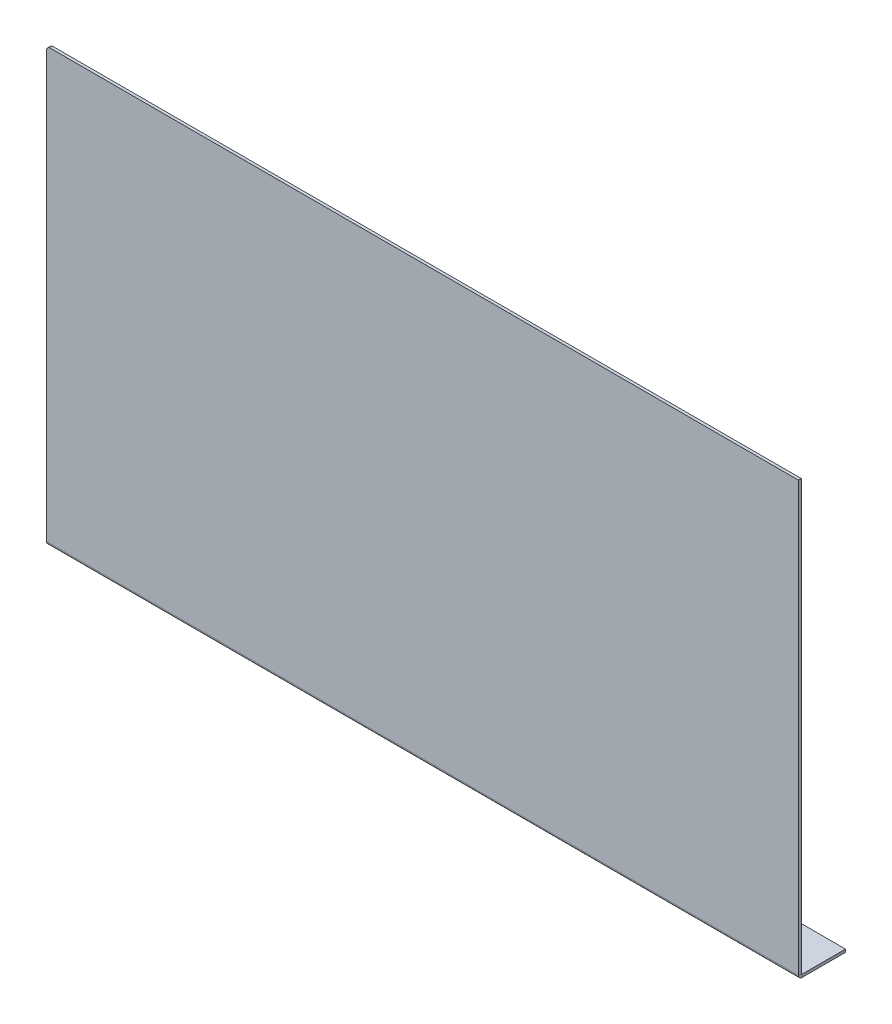
ISO-10303-21;
HEADER;
FILE_DESCRIPTION(('STEP AP214'),'2;1');
FILE_NAME('part.step','',(''),(''),'','','');
FILE_SCHEMA(('AUTOMOTIVE_DESIGN { 1 0 10303 214 1 1 1 1 }'));
ENDSEC;
DATA;
#1=APPLICATION_CONTEXT('core data for automotive mechanical design processes');
#2=APPLICATION_PROTOCOL_DEFINITION('international standard','automotive_design',2000,#1);
#3=PRODUCT_CONTEXT('',#1,'mechanical');
#4=PRODUCT('Part','Part','',(#3));
#5=PRODUCT_RELATED_PRODUCT_CATEGORY('part','',(#4));
#6=PRODUCT_DEFINITION_FORMATION('','',#4);
#7=PRODUCT_DEFINITION_CONTEXT('part definition',#1,'design');
#8=PRODUCT_DEFINITION('design','',#6,#7);
#9=PRODUCT_DEFINITION_SHAPE('','',#8);
#10=(LENGTH_UNIT() NAMED_UNIT(*) SI_UNIT(.MILLI.,.METRE.));
#11=(NAMED_UNIT(*) PLANE_ANGLE_UNIT() SI_UNIT($,.RADIAN.));
#12=(NAMED_UNIT(*) SI_UNIT($,.STERADIAN.) SOLID_ANGLE_UNIT());
#13=UNCERTAINTY_MEASURE_WITH_UNIT(LENGTH_MEASURE(1.E-05),#10,'distance_accuracy_value','');
#14=(GEOMETRIC_REPRESENTATION_CONTEXT(3) GLOBAL_UNCERTAINTY_ASSIGNED_CONTEXT((#13)) GLOBAL_UNIT_ASSIGNED_CONTEXT((#10,
#11,#12)) REPRESENTATION_CONTEXT('',''));
#15=CARTESIAN_POINT('',(0.,0.,0.));
#16=DIRECTION('',(0.,0.,1.));
#17=DIRECTION('',(1.,0.,0.));
#18=AXIS2_PLACEMENT_3D('',#15,#16,#17);
#19=CARTESIAN_POINT('',(176.5,-124.5,-25.));
#20=DIRECTION('',(-1.,0.,0.));
#21=DIRECTION('',(0.,-1.,0.));
#22=AXIS2_PLACEMENT_3D('',#19,#20,#21);
#23=PLANE('',#22);
#24=DIRECTION('',(0.,0.,-1.));
#25=VECTOR('',#24,1.);
#26=CARTESIAN_POINT('',(176.5,-122.171572875254,-23.5));
#27=LINE('',#26,#25);
#28=CARTESIAN_POINT('',(176.5,-122.171572875254,-23.5));
#29=VERTEX_POINT('',#28);
#30=CARTESIAN_POINT('',(176.5,-122.171572875254,-25.));
#31=VERTEX_POINT('',#30);
#32=EDGE_CURVE('E315',#29,#31,#27,.T.);
#33=ORIENTED_EDGE('',*,*,#32,.T.);
#34=DIRECTION('',(0.,-1.,0.));
#35=VECTOR('',#34,1.);
#36=CARTESIAN_POINT('',(176.5,5.20906600551264E-13,-25.));
#37=LINE('',#36,#35);
#38=CARTESIAN_POINT('',(176.5,-115.5,-25.));
#39=VERTEX_POINT('',#38);
#40=EDGE_CURVE('E334',#39,#31,#37,.T.);
#41=ORIENTED_EDGE('',*,*,#40,.F.);
#42=DIRECTION('',(0.,0.,1.));
#43=VECTOR('',#42,1.);
#44=CARTESIAN_POINT('',(176.5,-115.5,-23.5));
#45=LINE('',#44,#43);
#46=CARTESIAN_POINT('',(176.5,-115.5,-23.5));
#47=VERTEX_POINT('',#46);
#48=EDGE_CURVE('E343',#47,#39,#45,.F.);
#49=ORIENTED_EDGE('',*,*,#48,.F.);
#50=DIRECTION('',(0.,1.,0.));
#51=VECTOR('',#50,1.);
#52=CARTESIAN_POINT('',(176.5,-124.5,-23.5));
#53=LINE('',#52,#51);
#54=EDGE_CURVE('E338',#47,#29,#53,.F.);
#55=ORIENTED_EDGE('',*,*,#54,.T.);
#56=EDGE_LOOP('',(#33,#41,#49,#55));
#57=FACE_BOUND('',#56,.T.);
#58=ADVANCED_FACE('F99',(#57),#23,.F.);
#59=CARTESIAN_POINT('',(-176.5,-115.,-25.));
#60=DIRECTION('',(1.,0.,0.));
#61=DIRECTION('',(0.,0.,-1.));
#62=AXIS2_PLACEMENT_3D('',#59,#60,#61);
#63=PLANE('',#62);
#64=DIRECTION('',(0.,0.,-1.));
#65=VECTOR('',#64,1.);
#66=CARTESIAN_POINT('',(-176.5,-122.171572875254,-23.5));
#67=LINE('',#66,#65);
#68=CARTESIAN_POINT('',(-176.5,-122.171572875254,-23.5));
#69=VERTEX_POINT('',#68);
#70=CARTESIAN_POINT('',(-176.5,-122.171572875254,-25.));
#71=VERTEX_POINT('',#70);
#72=EDGE_CURVE('E325',#69,#71,#67,.T.);
#73=ORIENTED_EDGE('',*,*,#72,.F.);
#74=DIRECTION('',(0.,-1.,0.));
#75=VECTOR('',#74,1.);
#76=CARTESIAN_POINT('',(-176.5,-115.,-23.5));
#77=LINE('',#76,#75);
#78=CARTESIAN_POINT('',(-176.5,-115.5,-23.5));
#79=VERTEX_POINT('',#78);
#80=EDGE_CURVE('E336',#69,#79,#77,.F.);
#81=ORIENTED_EDGE('',*,*,#80,.T.);
#82=DIRECTION('',(0.,0.,1.));
#83=VECTOR('',#82,1.);
#84=CARTESIAN_POINT('',(-176.5,-115.5,-25.));
#85=LINE('',#84,#83);
#86=CARTESIAN_POINT('',(-176.5,-115.5,-25.));
#87=VERTEX_POINT('',#86);
#88=EDGE_CURVE('E328',#79,#87,#85,.F.);
#89=ORIENTED_EDGE('',*,*,#88,.T.);
#90=DIRECTION('',(0.,1.,0.));
#91=VECTOR('',#90,1.);
#92=CARTESIAN_POINT('',(-176.5,0.,-25.));
#93=LINE('',#92,#91);
#94=EDGE_CURVE('E331',#71,#87,#93,.T.);
#95=ORIENTED_EDGE('',*,*,#94,.F.);
#96=EDGE_LOOP('',(#73,#81,#89,#95));
#97=FACE_BOUND('',#96,.T.);
#98=ADVANCED_FACE('F560',(#97),#63,.F.);
#99=CARTESIAN_POINT('',(0.,0.,-25.));
#100=DIRECTION('',(0.,0.,1.));
#101=DIRECTION('',(1.,0.,0.));
#102=AXIS2_PLACEMENT_3D('',#99,#100,#101);
#103=PLANE('',#102);
#104=DIRECTION('',(1.,0.,0.));
#105=VECTOR('',#104,1.);
#106=CARTESIAN_POINT('',(176.5,-122.171572875254,-25.));
#107=LINE('',#106,#105);
#108=EDGE_CURVE('E309',#31,#71,#107,.F.);
#109=ORIENTED_EDGE('',*,*,#108,.T.);
#110=ORIENTED_EDGE('',*,*,#94,.T.);
#111=DIRECTION('',(1.,0.,0.));
#112=VECTOR('',#111,1.);
#113=CARTESIAN_POINT('',(-176.5,-115.5,-25.));
#114=LINE('',#113,#112);
#115=EDGE_CURVE('E340',#39,#87,#114,.F.);
#116=ORIENTED_EDGE('',*,*,#115,.F.);
#117=ORIENTED_EDGE('',*,*,#40,.T.);
#118=EDGE_LOOP('',(#109,#110,#116,#117));
#119=FACE_BOUND('',#118,.T.);
#120=ADVANCED_FACE('F566',(#119),#103,.F.);
#121=CARTESIAN_POINT('',(0.,0.,-23.5));
#122=DIRECTION('',(0.,0.,1.));
#123=DIRECTION('',(1.,0.,0.));
#124=AXIS2_PLACEMENT_3D('',#121,#122,#123);
#125=PLANE('',#124);
#126=ORIENTED_EDGE('',*,*,#80,.F.);
#127=DIRECTION('',(1.,0.,0.));
#128=VECTOR('',#127,1.);
#129=CARTESIAN_POINT('',(176.5,-122.171572875254,-23.5));
#130=LINE('',#129,#128);
#131=EDGE_CURVE('E114',#29,#69,#130,.F.);
#132=ORIENTED_EDGE('',*,*,#131,.F.);
#133=ORIENTED_EDGE('',*,*,#54,.F.);
#134=DIRECTION('',(1.,0.,0.));
#135=VECTOR('',#134,1.);
#136=CARTESIAN_POINT('',(-176.5,-115.5,-23.5));
#137=LINE('',#136,#135);
#138=EDGE_CURVE('E346',#79,#47,#137,.T.);
#139=ORIENTED_EDGE('',*,*,#138,.F.);
#140=EDGE_LOOP('',(#126,#132,#133,#139));
#141=FACE_BOUND('',#140,.T.);
#142=ADVANCED_FACE('F613',(#141),#125,.T.);
#143=CARTESIAN_POINT('',(0.,-115.,4.12712693812177E-13));
#144=DIRECTION('',(0.,-1.,0.));
#145=DIRECTION('',(0.,0.,-1.));
#146=AXIS2_PLACEMENT_3D('',#143,#144,#145);
#147=PLANE('',#146);
#148=DIRECTION('',(-1.,0.,0.));
#149=VECTOR('',#148,1.);
#150=CARTESIAN_POINT('',(177.25,-115.,-22.25));
#151=LINE('',#150,#149);
#152=CARTESIAN_POINT('',(177.25,-115.,-22.25));
#153=VERTEX_POINT('',#152);
#154=CARTESIAN_POINT('',(176.5,-115.,-22.25));
#155=VERTEX_POINT('',#154);
#156=EDGE_CURVE('E379',#153,#155,#151,.T.);
#157=ORIENTED_EDGE('',*,*,#156,.F.);
#158=DIRECTION('',(0.,0.,1.));
#159=VECTOR('',#158,1.);
#160=CARTESIAN_POINT('',(177.25,-115.,-25.));
#161=LINE('',#160,#159);
#162=CARTESIAN_POINT('',(177.25,-115.,-25.));
#163=VERTEX_POINT('',#162);
#164=EDGE_CURVE('E374',#163,#153,#161,.T.);
#165=ORIENTED_EDGE('',*,*,#164,.F.);
#166=DIRECTION('',(-1.,0.,0.));
#167=VECTOR('',#166,1.);
#168=CARTESIAN_POINT('',(-200.,-115.,-25.));
#169=LINE('',#168,#167);
#170=CARTESIAN_POINT('',(200.,-115.,-25.));
#171=VERTEX_POINT('',#170);
#172=EDGE_CURVE('E421',#171,#163,#169,.T.);
#173=ORIENTED_EDGE('',*,*,#172,.F.);
#174=DIRECTION('',(0.,0.,-1.));
#175=VECTOR('',#174,1.);
#176=CARTESIAN_POINT('',(200.,-115.,-25.));
#177=LINE('',#176,#175);
#178=CARTESIAN_POINT('',(200.,-115.,-1.79999999999994));
#179=VERTEX_POINT('',#178);
#180=EDGE_CURVE('E425',#179,#171,#177,.T.);
#181=ORIENTED_EDGE('',*,*,#180,.F.);
#182=DIRECTION('',(-1.,0.,0.));
#183=VECTOR('',#182,1.);
#184=CARTESIAN_POINT('',(0.,-115.,-1.79999999999994));
#185=LINE('',#184,#183);
#186=CARTESIAN_POINT('',(-200.,-115.,-1.79999999999989));
#187=VERTEX_POINT('',#186);
#188=EDGE_CURVE('E436',#179,#187,#185,.T.);
#189=ORIENTED_EDGE('',*,*,#188,.T.);
#190=DIRECTION('',(0.,0.,1.));
#191=VECTOR('',#190,1.);
#192=CARTESIAN_POINT('',(-200.,-115.,-1.49999999999992));
#193=LINE('',#192,#191);
#194=CARTESIAN_POINT('',(-200.,-115.,-25.));
#195=VERTEX_POINT('',#194);
#196=EDGE_CURVE('E418',#195,#187,#193,.T.);
#197=ORIENTED_EDGE('',*,*,#196,.F.);
#198=CARTESIAN_POINT('',(-177.25,-115.,-25.));
#199=VERTEX_POINT('',#198);
#200=EDGE_CURVE('E424',#199,#195,#169,.T.);
#201=ORIENTED_EDGE('',*,*,#200,.F.);
#202=DIRECTION('',(0.,0.,-1.));
#203=VECTOR('',#202,1.);
#204=CARTESIAN_POINT('',(-177.25,-115.,-22.25));
#205=LINE('',#204,#203);
#206=CARTESIAN_POINT('',(-177.25,-115.,-22.25));
#207=VERTEX_POINT('',#206);
#208=EDGE_CURVE('E393',#207,#199,#205,.T.);
#209=ORIENTED_EDGE('',*,*,#208,.F.);
#210=DIRECTION('',(-1.,0.,0.));
#211=VECTOR('',#210,1.);
#212=CARTESIAN_POINT('',(-176.5,-115.,-22.25));
#213=LINE('',#212,#211);
#214=CARTESIAN_POINT('',(-176.5,-115.,-22.25));
#215=VERTEX_POINT('',#214);
#216=EDGE_CURVE('E389',#215,#207,#213,.T.);
#217=ORIENTED_EDGE('',*,*,#216,.F.);
#218=DIRECTION('',(0.,0.,1.));
#219=VECTOR('',#218,1.);
#220=CARTESIAN_POINT('',(-176.5,-115.,-23.));
#221=LINE('',#220,#219);
#222=CARTESIAN_POINT('',(-176.5,-115.,-23.));
#223=VERTEX_POINT('',#222);
#224=EDGE_CURVE('E386',#223,#215,#221,.T.);
#225=ORIENTED_EDGE('',*,*,#224,.F.);
#226=DIRECTION('',(1.,0.,0.));
#227=VECTOR('',#226,1.);
#228=CARTESIAN_POINT('',(176.5,-115.,-23.));
#229=LINE('',#228,#227);
#230=CARTESIAN_POINT('',(176.5,-115.,-23.));
#231=VERTEX_POINT('',#230);
#232=EDGE_CURVE('E363',#231,#223,#229,.F.);
#233=ORIENTED_EDGE('',*,*,#232,.F.);
#234=DIRECTION('',(0.,0.,-1.));
#235=VECTOR('',#234,1.);
#236=CARTESIAN_POINT('',(176.5,-115.,-22.25));
#237=LINE('',#236,#235);
#238=EDGE_CURVE('E383',#155,#231,#237,.T.);
#239=ORIENTED_EDGE('',*,*,#238,.F.);
#240=EDGE_LOOP('',(#157,#165,#173,#181,#189,#197,#201,#209,#217,#225,#233,#239));
#241=FACE_BOUND('',#240,.T.);
#242=ADVANCED_FACE('F533',(#241),#147,.T.);
#243=CARTESIAN_POINT('',(0.,-113.5,4.07475471803913E-13));
#244=DIRECTION('',(0.,-1.,0.));
#245=DIRECTION('',(0.,0.,-1.));
#246=AXIS2_PLACEMENT_3D('',#243,#244,#245);
#247=PLANE('',#246);
#248=DIRECTION('',(0.,0.,-1.));
#249=VECTOR('',#248,1.);
#250=CARTESIAN_POINT('',(177.25,-113.5,2.19644848193854E-12));
#251=LINE('',#250,#249);
#252=CARTESIAN_POINT('',(177.25,-113.5,-22.25));
#253=VERTEX_POINT('',#252);
#254=CARTESIAN_POINT('',(177.25,-113.5,-25.));
#255=VERTEX_POINT('',#254);
#256=EDGE_CURVE('E408',#253,#255,#251,.T.);
#257=ORIENTED_EDGE('',*,*,#256,.F.);
#258=DIRECTION('',(1.,0.,0.));
#259=VECTOR('',#258,1.);
#260=CARTESIAN_POINT('',(0.,-113.5,-22.25));
#261=LINE('',#260,#259);
#262=CARTESIAN_POINT('',(176.5,-113.5,-22.25));
#263=VERTEX_POINT('',#262);
#264=EDGE_CURVE('E491',#263,#253,#261,.T.);
#265=ORIENTED_EDGE('',*,*,#264,.F.);
#266=DIRECTION('',(0.,0.,1.));
#267=VECTOR('',#266,1.);
#268=CARTESIAN_POINT('',(176.5,-113.5,4.07475471803913E-13));
#269=LINE('',#268,#267);
#270=CARTESIAN_POINT('',(176.5,-113.5,-23.));
#271=VERTEX_POINT('',#270);
#272=EDGE_CURVE('E489',#271,#263,#269,.T.);
#273=ORIENTED_EDGE('',*,*,#272,.F.);
#274=DIRECTION('',(1.,0.,0.));
#275=VECTOR('',#274,1.);
#276=CARTESIAN_POINT('',(176.5,-113.5,-23.));
#277=LINE('',#276,#275);
#278=CARTESIAN_POINT('',(-176.5,-113.5,-23.));
#279=VERTEX_POINT('',#278);
#280=EDGE_CURVE('E350',#271,#279,#277,.F.);
#281=ORIENTED_EDGE('',*,*,#280,.T.);
#282=DIRECTION('',(0.,0.,-1.));
#283=VECTOR('',#282,1.);
#284=CARTESIAN_POINT('',(-176.5,-113.5,4.07475471803913E-13));
#285=LINE('',#284,#283);
#286=CARTESIAN_POINT('',(-176.5,-113.5,-22.25));
#287=VERTEX_POINT('',#286);
#288=EDGE_CURVE('E487',#287,#279,#285,.T.);
#289=ORIENTED_EDGE('',*,*,#288,.F.);
#290=DIRECTION('',(1.,0.,0.));
#291=VECTOR('',#290,1.);
#292=CARTESIAN_POINT('',(0.,-113.5,-22.25));
#293=LINE('',#292,#291);
#294=CARTESIAN_POINT('',(-177.25,-113.5,-22.25));
#295=VERTEX_POINT('',#294);
#296=EDGE_CURVE('E485',#295,#287,#293,.T.);
#297=ORIENTED_EDGE('',*,*,#296,.F.);
#298=DIRECTION('',(0.,0.,1.));
#299=VECTOR('',#298,1.);
#300=CARTESIAN_POINT('',(-177.25,-113.5,4.07475471803913E-13));
#301=LINE('',#300,#299);
#302=CARTESIAN_POINT('',(-177.25,-113.5,-25.));
#303=VERTEX_POINT('',#302);
#304=EDGE_CURVE('E377',#303,#295,#301,.T.);
#305=ORIENTED_EDGE('',*,*,#304,.F.);
#306=DIRECTION('',(1.,0.,0.));
#307=VECTOR('',#306,1.);
#308=CARTESIAN_POINT('',(0.,-113.5,-25.));
#309=LINE('',#308,#307);
#310=CARTESIAN_POINT('',(-200.,-113.5,-25.));
#311=VERTEX_POINT('',#310);
#312=EDGE_CURVE('E433',#303,#311,#309,.F.);
#313=ORIENTED_EDGE('',*,*,#312,.T.);
#314=DIRECTION('',(0.,0.,-1.));
#315=VECTOR('',#314,1.);
#316=CARTESIAN_POINT('',(-200.,-113.5,4.07475471803913E-13));
#317=LINE('',#316,#315);
#318=CARTESIAN_POINT('',(-200.,-113.5,-1.79999999999995));
#319=VERTEX_POINT('',#318);
#320=EDGE_CURVE('E427',#311,#319,#317,.F.);
#321=ORIENTED_EDGE('',*,*,#320,.T.);
#322=DIRECTION('',(1.,0.,0.));
#323=VECTOR('',#322,1.);
#324=CARTESIAN_POINT('',(200.,-113.5,-1.8));
#325=LINE('',#324,#323);
#326=CARTESIAN_POINT('',(200.,-113.5,-1.79999999999995));
#327=VERTEX_POINT('',#326);
#328=EDGE_CURVE('E442',#327,#319,#325,.F.);
#329=ORIENTED_EDGE('',*,*,#328,.F.);
#330=DIRECTION('',(0.,0.,1.));
#331=VECTOR('',#330,1.);
#332=CARTESIAN_POINT('',(200.,-113.5,6.43693136617775E-13));
#333=LINE('',#332,#331);
#334=CARTESIAN_POINT('',(200.,-113.5,-25.));
#335=VERTEX_POINT('',#334);
#336=EDGE_CURVE('E434',#327,#335,#333,.F.);
#337=ORIENTED_EDGE('',*,*,#336,.T.);
#338=EDGE_CURVE('E430',#335,#255,#309,.F.);
#339=ORIENTED_EDGE('',*,*,#338,.T.);
#340=EDGE_LOOP('',(#257,#265,#273,#281,#289,#297,#305,#313,#321,#329,#337,#339));
#341=FACE_BOUND('',#340,.T.);
#342=ADVANCED_FACE('F541',(#341),#247,.F.);
#343=CARTESIAN_POINT('',(-200.,-115.,-25.));
#344=DIRECTION('',(0.,0.,-1.));
#345=DIRECTION('',(0.,1.,0.));
#346=AXIS2_PLACEMENT_3D('',#343,#344,#345);
#347=PLANE('',#346);
#348=ORIENTED_EDGE('',*,*,#172,.T.);
#349=DIRECTION('',(0.,1.,0.));
#350=VECTOR('',#349,1.);
#351=CARTESIAN_POINT('',(177.25,-115.,-25.));
#352=LINE('',#351,#350);
#353=EDGE_CURVE('E378',#163,#255,#352,.T.);
#354=ORIENTED_EDGE('',*,*,#353,.T.);
#355=ORIENTED_EDGE('',*,*,#338,.F.);
#356=DIRECTION('',(0.,1.,0.));
#357=VECTOR('',#356,1.);
#358=CARTESIAN_POINT('',(200.,-115.,-25.));
#359=LINE('',#358,#357);
#360=EDGE_CURVE('E415',#171,#335,#359,.T.);
#361=ORIENTED_EDGE('',*,*,#360,.F.);
#362=EDGE_LOOP('',(#348,#354,#355,#361));
#363=FACE_BOUND('',#362,.T.);
#364=ADVANCED_FACE('F537',(#363),#347,.T.);
#365=ORIENTED_EDGE('',*,*,#312,.F.);
#366=DIRECTION('',(0.,1.,0.));
#367=VECTOR('',#366,1.);
#368=CARTESIAN_POINT('',(-177.25,-115.,-25.));
#369=LINE('',#368,#367);
#370=EDGE_CURVE('E395',#199,#303,#369,.T.);
#371=ORIENTED_EDGE('',*,*,#370,.F.);
#372=ORIENTED_EDGE('',*,*,#200,.T.);
#373=DIRECTION('',(0.,1.,0.));
#374=VECTOR('',#373,1.);
#375=CARTESIAN_POINT('',(-200.,-115.,-25.));
#376=LINE('',#375,#374);
#377=EDGE_CURVE('E411',#195,#311,#376,.T.);
#378=ORIENTED_EDGE('',*,*,#377,.T.);
#379=EDGE_LOOP('',(#365,#371,#372,#378));
#380=FACE_BOUND('',#379,.T.);
#381=ADVANCED_FACE('F620',(#380),#347,.T.);
#382=CARTESIAN_POINT('',(-200.,115.,-1.5));
#383=DIRECTION('',(-1.,0.,0.));
#384=DIRECTION('',(0.,-1.,0.));
#385=AXIS2_PLACEMENT_3D('',#382,#383,#384);
#386=PLANE('',#385);
#387=DIRECTION('',(0.,-1.,0.));
#388=VECTOR('',#387,1.);
#389=CARTESIAN_POINT('',(-200.,115.,0.));
#390=LINE('',#389,#388);
#391=CARTESIAN_POINT('',(-200.,113.,0.));
#392=VERTEX_POINT('',#391);
#393=CARTESIAN_POINT('',(-200.,-113.2,0.));
#394=VERTEX_POINT('',#393);
#395=EDGE_CURVE('E472',#392,#394,#390,.T.);
#396=ORIENTED_EDGE('',*,*,#395,.F.);
#397=DIRECTION('',(0.,0.,1.));
#398=VECTOR('',#397,1.);
#399=CARTESIAN_POINT('',(-200.,113.,-1.5));
#400=LINE('',#399,#398);
#401=CARTESIAN_POINT('',(-200.,113.,-1.5));
#402=VERTEX_POINT('',#401);
#403=EDGE_CURVE('E107',#392,#402,#400,.F.);
#404=ORIENTED_EDGE('',*,*,#403,.T.);
#405=DIRECTION('',(0.,-1.,0.));
#406=VECTOR('',#405,1.);
#407=CARTESIAN_POINT('',(-200.,115.,-1.5));
#408=LINE('',#407,#406);
#409=CARTESIAN_POINT('',(-200.,-113.2,-1.49999999999995));
#410=VERTEX_POINT('',#409);
#411=EDGE_CURVE('E475',#402,#410,#408,.T.);
#412=ORIENTED_EDGE('',*,*,#411,.T.);
#413=DIRECTION('',(0.,0.,1.));
#414=VECTOR('',#413,1.);
#415=CARTESIAN_POINT('',(-200.,-113.2,-1.49999999999995));
#416=LINE('',#415,#414);
#417=EDGE_CURVE('E453',#410,#394,#416,.T.);
#418=ORIENTED_EDGE('',*,*,#417,.T.);
#419=EDGE_LOOP('',(#396,#404,#412,#418));
#420=FACE_BOUND('',#419,.T.);
#421=ADVANCED_FACE('F503',(#420),#386,.T.);
#422=CARTESIAN_POINT('',(0.,0.,-1.5));
#423=DIRECTION('',(0.,0.,1.));
#424=DIRECTION('',(1.,0.,0.));
#425=AXIS2_PLACEMENT_3D('',#422,#423,#424);
#426=PLANE('',#425);
#427=ORIENTED_EDGE('',*,*,#411,.F.);
#428=CARTESIAN_POINT('',(-198.,113.,-1.5));
#429=DIRECTION('',(0.,0.,1.));
#430=DIRECTION('',(1.,0.,0.));
#431=AXIS2_PLACEMENT_3D('',#428,#429,#430);
#432=CIRCLE('',#431,2.);
#433=CARTESIAN_POINT('',(-198.,115.,-1.5));
#434=VERTEX_POINT('',#433);
#435=EDGE_CURVE('E13',#402,#434,#432,.F.);
#436=ORIENTED_EDGE('',*,*,#435,.T.);
#437=DIRECTION('',(-1.,0.,0.));
#438=VECTOR('',#437,1.);
#439=CARTESIAN_POINT('',(-200.,115.,-1.5));
#440=LINE('',#439,#438);
#441=CARTESIAN_POINT('',(200.,115.,-1.5));
#442=VERTEX_POINT('',#441);
#443=EDGE_CURVE('E471',#442,#434,#440,.T.);
#444=ORIENTED_EDGE('',*,*,#443,.F.);
#445=DIRECTION('',(0.,1.,0.));
#446=VECTOR('',#445,1.);
#447=CARTESIAN_POINT('',(200.,115.,-1.5));
#448=LINE('',#447,#446);
#449=CARTESIAN_POINT('',(200.,-113.2,-1.49999999999995));
#450=VERTEX_POINT('',#449);
#451=EDGE_CURVE('E469',#450,#442,#448,.T.);
#452=ORIENTED_EDGE('',*,*,#451,.F.);
#453=DIRECTION('',(-1.,0.,0.));
#454=VECTOR('',#453,1.);
#455=CARTESIAN_POINT('',(-200.,-113.2,-1.49999999999995));
#456=LINE('',#455,#454);
#457=EDGE_CURVE('E459',#410,#450,#456,.F.);
#458=ORIENTED_EDGE('',*,*,#457,.F.);
#459=EDGE_LOOP('',(#427,#436,#444,#452,#458));
#460=FACE_BOUND('',#459,.T.);
#461=ADVANCED_FACE('F508',(#460),#426,.F.);
#462=CARTESIAN_POINT('',(0.,0.,0.));
#463=DIRECTION('',(0.,0.,1.));
#464=DIRECTION('',(1.,0.,0.));
#465=AXIS2_PLACEMENT_3D('',#462,#463,#464);
#466=PLANE('',#465);
#467=DIRECTION('',(-1.,0.,0.));
#468=VECTOR('',#467,1.);
#469=CARTESIAN_POINT('',(-200.,115.,0.));
#470=LINE('',#469,#468);
#471=CARTESIAN_POINT('',(200.,115.,0.));
#472=VERTEX_POINT('',#471);
#473=CARTESIAN_POINT('',(-198.,115.,0.));
#474=VERTEX_POINT('',#473);
#475=EDGE_CURVE('E479',#472,#474,#470,.T.);
#476=ORIENTED_EDGE('',*,*,#475,.T.);
#477=CARTESIAN_POINT('',(-198.,113.,0.));
#478=DIRECTION('',(0.,0.,1.));
#479=DIRECTION('',(1.,0.,0.));
#480=AXIS2_PLACEMENT_3D('',#477,#478,#479);
#481=CIRCLE('',#480,2.);
#482=EDGE_CURVE('E496',#474,#392,#481,.T.);
#483=ORIENTED_EDGE('',*,*,#482,.T.);
#484=ORIENTED_EDGE('',*,*,#395,.T.);
#485=DIRECTION('',(-1.,0.,0.));
#486=VECTOR('',#485,1.);
#487=CARTESIAN_POINT('',(-200.,-113.2,0.));
#488=LINE('',#487,#486);
#489=CARTESIAN_POINT('',(200.,-113.2,0.));
#490=VERTEX_POINT('',#489);
#491=EDGE_CURVE('E446',#394,#490,#488,.F.);
#492=ORIENTED_EDGE('',*,*,#491,.T.);
#493=DIRECTION('',(0.,1.,0.));
#494=VECTOR('',#493,1.);
#495=CARTESIAN_POINT('',(200.,115.,0.));
#496=LINE('',#495,#494);
#497=EDGE_CURVE('E466',#490,#472,#496,.T.);
#498=ORIENTED_EDGE('',*,*,#497,.T.);
#499=EDGE_LOOP('',(#476,#483,#484,#492,#498));
#500=FACE_BOUND('',#499,.T.);
#501=ADVANCED_FACE('F498',(#500),#466,.T.);
#502=CARTESIAN_POINT('',(200.,115.,-1.5));
#503=DIRECTION('',(1.,0.,0.));
#504=DIRECTION('',(0.,1.,0.));
#505=AXIS2_PLACEMENT_3D('',#502,#503,#504);
#506=PLANE('',#505);
#507=DIRECTION('',(0.,0.,1.));
#508=VECTOR('',#507,1.);
#509=CARTESIAN_POINT('',(200.,-113.2,-1.49999999999995));
#510=LINE('',#509,#508);
#511=EDGE_CURVE('E463',#450,#490,#510,.T.);
#512=ORIENTED_EDGE('',*,*,#511,.F.);
#513=ORIENTED_EDGE('',*,*,#451,.T.);
#514=DIRECTION('',(0.,0.,1.));
#515=VECTOR('',#514,1.);
#516=CARTESIAN_POINT('',(200.,115.,-1.5));
#517=LINE('',#516,#515);
#518=EDGE_CURVE('E477',#442,#472,#517,.T.);
#519=ORIENTED_EDGE('',*,*,#518,.T.);
#520=ORIENTED_EDGE('',*,*,#497,.F.);
#521=EDGE_LOOP('',(#512,#513,#519,#520));
#522=FACE_BOUND('',#521,.T.);
#523=ADVANCED_FACE('F517',(#522),#506,.T.);
#524=CARTESIAN_POINT('',(-200.,115.,-1.5));
#525=DIRECTION('',(0.,1.,0.));
#526=DIRECTION('',(0.,0.,1.));
#527=AXIS2_PLACEMENT_3D('',#524,#525,#526);
#528=PLANE('',#527);
#529=ORIENTED_EDGE('',*,*,#443,.T.);
#530=DIRECTION('',(0.,0.,1.));
#531=VECTOR('',#530,1.);
#532=CARTESIAN_POINT('',(-198.,115.,-1.5));
#533=LINE('',#532,#531);
#534=EDGE_CURVE('E493',#434,#474,#533,.T.);
#535=ORIENTED_EDGE('',*,*,#534,.T.);
#536=ORIENTED_EDGE('',*,*,#475,.F.);
#537=ORIENTED_EDGE('',*,*,#518,.F.);
#538=EDGE_LOOP('',(#529,#535,#536,#537));
#539=FACE_BOUND('',#538,.T.);
#540=ADVANCED_FACE('F513',(#539),#528,.T.);
#541=CARTESIAN_POINT('',(200.,-113.2,-1.79999999999995));
#542=DIRECTION('',(1.,0.,0.));
#543=DIRECTION('',(0.,0.,-1.));
#544=AXIS2_PLACEMENT_3D('',#541,#542,#543);
#545=PLANE('',#544);
#546=DIRECTION('',(0.,-1.,0.));
#547=VECTOR('',#546,1.);
#548=CARTESIAN_POINT('',(200.,-115.,-1.79999999999999));
#549=LINE('',#548,#547);
#550=EDGE_CURVE('E410',#327,#179,#549,.T.);
#551=ORIENTED_EDGE('',*,*,#550,.F.);
#552=CARTESIAN_POINT('',(200.,-113.2,-1.79999999999995));
#553=DIRECTION('',(-1.,0.,0.));
#554=DIRECTION('',(0.,0.,1.));
#555=AXIS2_PLACEMENT_3D('',#552,#553,#554);
#556=CIRCLE('',#555,0.299999999999995);
#557=EDGE_CURVE('E456',#450,#327,#556,.F.);
#558=ORIENTED_EDGE('',*,*,#557,.F.);
#559=ORIENTED_EDGE('',*,*,#511,.T.);
#560=CARTESIAN_POINT('',(200.,-113.2,-1.79999999999995));
#561=DIRECTION('',(-1.,0.,0.));
#562=DIRECTION('',(0.,0.,1.));
#563=AXIS2_PLACEMENT_3D('',#560,#561,#562);
#564=CIRCLE('',#563,1.79999999999999);
#565=EDGE_CURVE('E449',#490,#179,#564,.F.);
#566=ORIENTED_EDGE('',*,*,#565,.T.);
#567=EDGE_LOOP('',(#551,#558,#559,#566));
#568=FACE_BOUND('',#567,.T.);
#569=ADVANCED_FACE('F524',(#568),#545,.T.);
#570=CARTESIAN_POINT('',(-200.,-113.2,-1.79999999999995));
#571=DIRECTION('',(1.,0.,0.));
#572=DIRECTION('',(0.,0.,-1.));
#573=AXIS2_PLACEMENT_3D('',#570,#571,#572);
#574=PLANE('',#573);
#575=CARTESIAN_POINT('',(-200.,-113.2,-1.79999999999995));
#576=DIRECTION('',(-1.,0.,0.));
#577=DIRECTION('',(0.,0.,1.));
#578=AXIS2_PLACEMENT_3D('',#575,#576,#577);
#579=CIRCLE('',#578,0.299999999999995);
#580=EDGE_CURVE('E414',#319,#410,#579,.T.);
#581=ORIENTED_EDGE('',*,*,#580,.F.);
#582=DIRECTION('',(0.,-1.,0.));
#583=VECTOR('',#582,1.);
#584=CARTESIAN_POINT('',(-200.,-113.5,-1.7999999999999));
#585=LINE('',#584,#583);
#586=EDGE_CURVE('E439',#319,#187,#585,.T.);
#587=ORIENTED_EDGE('',*,*,#586,.T.);
#588=CARTESIAN_POINT('',(-200.,-113.2,-1.79999999999995));
#589=DIRECTION('',(-1.,0.,0.));
#590=DIRECTION('',(0.,0.,1.));
#591=AXIS2_PLACEMENT_3D('',#588,#589,#590);
#592=CIRCLE('',#591,1.79999999999999);
#593=EDGE_CURVE('E450',#187,#394,#592,.T.);
#594=ORIENTED_EDGE('',*,*,#593,.T.);
#595=ORIENTED_EDGE('',*,*,#417,.F.);
#596=EDGE_LOOP('',(#581,#587,#594,#595));
#597=FACE_BOUND('',#596,.T.);
#598=ADVANCED_FACE('F546',(#597),#574,.F.);
#599=CARTESIAN_POINT('',(-200.,-113.2,-1.79999999999995));
#600=DIRECTION('',(-1.,0.,0.));
#601=DIRECTION('',(0.,-1.,0.));
#602=AXIS2_PLACEMENT_3D('',#599,#600,#601);
#603=CYLINDRICAL_SURFACE('',#602,1.79999999999999);
#604=ORIENTED_EDGE('',*,*,#491,.F.);
#605=ORIENTED_EDGE('',*,*,#593,.F.);
#606=ORIENTED_EDGE('',*,*,#188,.F.);
#607=ORIENTED_EDGE('',*,*,#565,.F.);
#608=EDGE_LOOP('',(#604,#605,#606,#607));
#609=FACE_BOUND('',#608,.T.);
#610=ADVANCED_FACE('F548',(#609),#603,.T.);
#611=CARTESIAN_POINT('',(-200.,-113.2,-1.79999999999995));
#612=DIRECTION('',(-1.,0.,0.));
#613=DIRECTION('',(0.,-1.,0.));
#614=AXIS2_PLACEMENT_3D('',#611,#612,#613);
#615=CYLINDRICAL_SURFACE('',#614,0.299999999999995);
#616=ORIENTED_EDGE('',*,*,#457,.T.);
#617=ORIENTED_EDGE('',*,*,#557,.T.);
#618=ORIENTED_EDGE('',*,*,#328,.T.);
#619=ORIENTED_EDGE('',*,*,#580,.T.);
#620=EDGE_LOOP('',(#616,#617,#618,#619));
#621=FACE_BOUND('',#620,.T.);
#622=ADVANCED_FACE('F520',(#621),#615,.F.);
#623=CARTESIAN_POINT('',(-200.,-115.,-1.49999999999992));
#624=DIRECTION('',(-1.,0.,0.));
#625=DIRECTION('',(0.,-1.,0.));
#626=AXIS2_PLACEMENT_3D('',#623,#624,#625);
#627=PLANE('',#626);
#628=ORIENTED_EDGE('',*,*,#196,.T.);
#629=ORIENTED_EDGE('',*,*,#586,.F.);
#630=ORIENTED_EDGE('',*,*,#320,.F.);
#631=ORIENTED_EDGE('',*,*,#377,.F.);
#632=EDGE_LOOP('',(#628,#629,#630,#631));
#633=FACE_BOUND('',#632,.T.);
#634=ADVANCED_FACE('F555',(#633),#627,.T.);
#635=CARTESIAN_POINT('',(200.,-115.,-25.));
#636=DIRECTION('',(1.,0.,0.));
#637=DIRECTION('',(0.,0.,-1.));
#638=AXIS2_PLACEMENT_3D('',#635,#636,#637);
#639=PLANE('',#638);
#640=ORIENTED_EDGE('',*,*,#336,.F.);
#641=ORIENTED_EDGE('',*,*,#550,.T.);
#642=ORIENTED_EDGE('',*,*,#180,.T.);
#643=ORIENTED_EDGE('',*,*,#360,.T.);
#644=EDGE_LOOP('',(#640,#641,#642,#643));
#645=FACE_BOUND('',#644,.T.);
#646=ADVANCED_FACE('F528',(#645),#639,.T.);
#647=CARTESIAN_POINT('',(177.25,-115.,-22.25));
#648=DIRECTION('',(0.,0.,-1.));
#649=DIRECTION('',(0.,1.,0.));
#650=AXIS2_PLACEMENT_3D('',#647,#648,#649);
#651=PLANE('',#650);
#652=DIRECTION('',(0.,1.,0.));
#653=VECTOR('',#652,1.);
#654=CARTESIAN_POINT('',(176.5,-115.,-22.25));
#655=LINE('',#654,#653);
#656=EDGE_CURVE('E385',#155,#263,#655,.T.);
#657=ORIENTED_EDGE('',*,*,#656,.T.);
#658=ORIENTED_EDGE('',*,*,#264,.T.);
#659=DIRECTION('',(0.,1.,0.));
#660=VECTOR('',#659,1.);
#661=CARTESIAN_POINT('',(177.25,-115.,-22.25));
#662=LINE('',#661,#660);
#663=EDGE_CURVE('E382',#153,#253,#662,.T.);
#664=ORIENTED_EDGE('',*,*,#663,.F.);
#665=ORIENTED_EDGE('',*,*,#156,.T.);
#666=EDGE_LOOP('',(#657,#658,#664,#665));
#667=FACE_BOUND('',#666,.T.);
#668=ADVANCED_FACE('F603',(#667),#651,.T.);
#669=CARTESIAN_POINT('',(176.5,-115.,-22.25));
#670=DIRECTION('',(1.,0.,0.));
#671=DIRECTION('',(0.,1.,0.));
#672=AXIS2_PLACEMENT_3D('',#669,#670,#671);
#673=PLANE('',#672);
#674=DIRECTION('',(0.,1.,0.));
#675=VECTOR('',#674,1.);
#676=CARTESIAN_POINT('',(176.5,-115.,-23.));
#677=LINE('',#676,#675);
#678=EDGE_CURVE('E357',#231,#271,#677,.T.);
#679=ORIENTED_EDGE('',*,*,#678,.T.);
#680=ORIENTED_EDGE('',*,*,#272,.T.);
#681=ORIENTED_EDGE('',*,*,#656,.F.);
#682=ORIENTED_EDGE('',*,*,#238,.T.);
#683=EDGE_LOOP('',(#679,#680,#681,#682));
#684=FACE_BOUND('',#683,.T.);
#685=ADVANCED_FACE('F599',(#684),#673,.T.);
#686=CARTESIAN_POINT('',(-176.5,-115.,-23.));
#687=DIRECTION('',(-1.,0.,0.));
#688=DIRECTION('',(0.,-1.,0.));
#689=AXIS2_PLACEMENT_3D('',#686,#687,#688);
#690=PLANE('',#689);
#691=DIRECTION('',(0.,1.,0.));
#692=VECTOR('',#691,1.);
#693=CARTESIAN_POINT('',(-176.5,-115.,-22.25));
#694=LINE('',#693,#692);
#695=EDGE_CURVE('E392',#215,#287,#694,.T.);
#696=ORIENTED_EDGE('',*,*,#695,.T.);
#697=ORIENTED_EDGE('',*,*,#288,.T.);
#698=DIRECTION('',(0.,1.,0.));
#699=VECTOR('',#698,1.);
#700=CARTESIAN_POINT('',(-176.5,-115.,-23.));
#701=LINE('',#700,#699);
#702=EDGE_CURVE('E368',#223,#279,#701,.T.);
#703=ORIENTED_EDGE('',*,*,#702,.F.);
#704=ORIENTED_EDGE('',*,*,#224,.T.);
#705=EDGE_LOOP('',(#696,#697,#703,#704));
#706=FACE_BOUND('',#705,.T.);
#707=ADVANCED_FACE('F595',(#706),#690,.T.);
#708=CARTESIAN_POINT('',(-176.5,-115.,-22.25));
#709=DIRECTION('',(0.,0.,-1.));
#710=DIRECTION('',(0.,1.,0.));
#711=AXIS2_PLACEMENT_3D('',#708,#709,#710);
#712=PLANE('',#711);
#713=DIRECTION('',(0.,1.,0.));
#714=VECTOR('',#713,1.);
#715=CARTESIAN_POINT('',(-177.25,-115.,-22.25));
#716=LINE('',#715,#714);
#717=EDGE_CURVE('E371',#207,#295,#716,.T.);
#718=ORIENTED_EDGE('',*,*,#717,.T.);
#719=ORIENTED_EDGE('',*,*,#296,.T.);
#720=ORIENTED_EDGE('',*,*,#695,.F.);
#721=ORIENTED_EDGE('',*,*,#216,.T.);
#722=EDGE_LOOP('',(#718,#719,#720,#721));
#723=FACE_BOUND('',#722,.T.);
#724=ADVANCED_FACE('F592',(#723),#712,.T.);
#725=CARTESIAN_POINT('',(177.25,-115.,-25.));
#726=DIRECTION('',(-1.,0.,0.));
#727=DIRECTION('',(0.,0.,1.));
#728=AXIS2_PLACEMENT_3D('',#725,#726,#727);
#729=PLANE('',#728);
#730=ORIENTED_EDGE('',*,*,#663,.T.);
#731=ORIENTED_EDGE('',*,*,#256,.T.);
#732=ORIENTED_EDGE('',*,*,#353,.F.);
#733=ORIENTED_EDGE('',*,*,#164,.T.);
#734=EDGE_LOOP('',(#730,#731,#732,#733));
#735=FACE_BOUND('',#734,.T.);
#736=ADVANCED_FACE('F590',(#735),#729,.T.);
#737=CARTESIAN_POINT('',(-177.25,-115.,-22.25));
#738=DIRECTION('',(1.,0.,0.));
#739=DIRECTION('',(0.,1.,0.));
#740=AXIS2_PLACEMENT_3D('',#737,#738,#739);
#741=PLANE('',#740);
#742=ORIENTED_EDGE('',*,*,#370,.T.);
#743=ORIENTED_EDGE('',*,*,#304,.T.);
#744=ORIENTED_EDGE('',*,*,#717,.F.);
#745=ORIENTED_EDGE('',*,*,#208,.T.);
#746=EDGE_LOOP('',(#742,#743,#744,#745));
#747=FACE_BOUND('',#746,.T.);
#748=ADVANCED_FACE('F583',(#747),#741,.T.);
#749=CARTESIAN_POINT('',(-176.5,-115.5,-23.));
#750=DIRECTION('',(-1.,0.,0.));
#751=DIRECTION('',(0.,0.,1.));
#752=AXIS2_PLACEMENT_3D('',#749,#750,#751);
#753=PLANE('',#752);
#754=ORIENTED_EDGE('',*,*,#88,.F.);
#755=CARTESIAN_POINT('',(-176.5,-115.5,-23.));
#756=DIRECTION('',(1.,0.,0.));
#757=DIRECTION('',(0.,0.,-1.));
#758=AXIS2_PLACEMENT_3D('',#755,#756,#757);
#759=CIRCLE('',#758,0.5);
#760=EDGE_CURVE('E360',#223,#79,#759,.F.);
#761=ORIENTED_EDGE('',*,*,#760,.F.);
#762=ORIENTED_EDGE('',*,*,#702,.T.);
#763=CARTESIAN_POINT('',(-176.5,-115.5,-23.));
#764=DIRECTION('',(1.,0.,0.));
#765=DIRECTION('',(0.,0.,-1.));
#766=AXIS2_PLACEMENT_3D('',#763,#764,#765);
#767=CIRCLE('',#766,2.);
#768=EDGE_CURVE('E353',#279,#87,#767,.F.);
#769=ORIENTED_EDGE('',*,*,#768,.T.);
#770=EDGE_LOOP('',(#754,#761,#762,#769));
#771=FACE_BOUND('',#770,.T.);
#772=ADVANCED_FACE('F580',(#771),#753,.T.);
#773=CARTESIAN_POINT('',(176.5,-115.5,-23.));
#774=DIRECTION('',(-1.,0.,0.));
#775=DIRECTION('',(0.,0.,1.));
#776=AXIS2_PLACEMENT_3D('',#773,#774,#775);
#777=PLANE('',#776);
#778=CARTESIAN_POINT('',(176.5,-115.5,-23.));
#779=DIRECTION('',(1.,0.,0.));
#780=DIRECTION('',(0.,0.,-1.));
#781=AXIS2_PLACEMENT_3D('',#778,#779,#780);
#782=CIRCLE('',#781,0.5);
#783=EDGE_CURVE('E333',#47,#231,#782,.T.);
#784=ORIENTED_EDGE('',*,*,#783,.F.);
#785=ORIENTED_EDGE('',*,*,#48,.T.);
#786=CARTESIAN_POINT('',(176.5,-115.5,-23.));
#787=DIRECTION('',(1.,0.,0.));
#788=DIRECTION('',(0.,0.,-1.));
#789=AXIS2_PLACEMENT_3D('',#786,#787,#788);
#790=CIRCLE('',#789,2.);
#791=EDGE_CURVE('E354',#39,#271,#790,.T.);
#792=ORIENTED_EDGE('',*,*,#791,.T.);
#793=ORIENTED_EDGE('',*,*,#678,.F.);
#794=EDGE_LOOP('',(#784,#785,#792,#793));
#795=FACE_BOUND('',#794,.T.);
#796=ADVANCED_FACE('F575',(#795),#777,.F.);
#797=CARTESIAN_POINT('',(176.5,-115.5,-23.));
#798=DIRECTION('',(1.,0.,0.));
#799=DIRECTION('',(0.,0.,-1.));
#800=AXIS2_PLACEMENT_3D('',#797,#798,#799);
#801=CYLINDRICAL_SURFACE('',#800,2.);
#802=ORIENTED_EDGE('',*,*,#280,.F.);
#803=ORIENTED_EDGE('',*,*,#791,.F.);
#804=ORIENTED_EDGE('',*,*,#115,.T.);
#805=ORIENTED_EDGE('',*,*,#768,.F.);
#806=EDGE_LOOP('',(#802,#803,#804,#805));
#807=FACE_BOUND('',#806,.T.);
#808=ADVANCED_FACE('F571',(#807),#801,.T.);
#809=CARTESIAN_POINT('',(176.5,-115.5,-23.));
#810=DIRECTION('',(1.,0.,0.));
#811=DIRECTION('',(0.,0.,-1.));
#812=AXIS2_PLACEMENT_3D('',#809,#810,#811);
#813=CYLINDRICAL_SURFACE('',#812,0.5);
#814=ORIENTED_EDGE('',*,*,#232,.T.);
#815=ORIENTED_EDGE('',*,*,#760,.T.);
#816=ORIENTED_EDGE('',*,*,#138,.T.);
#817=ORIENTED_EDGE('',*,*,#783,.T.);
#818=EDGE_LOOP('',(#814,#815,#816,#817));
#819=FACE_BOUND('',#818,.T.);
#820=ADVANCED_FACE('F574',(#819),#813,.F.);
#821=CARTESIAN_POINT('',(-198.,113.,-1.5));
#822=DIRECTION('',(0.,0.,1.));
#823=DIRECTION('',(1.,0.,0.));
#824=AXIS2_PLACEMENT_3D('',#821,#822,#823);
#825=CYLINDRICAL_SURFACE('',#824,2.);
#826=ORIENTED_EDGE('',*,*,#435,.F.);
#827=ORIENTED_EDGE('',*,*,#403,.F.);
#828=ORIENTED_EDGE('',*,*,#482,.F.);
#829=ORIENTED_EDGE('',*,*,#534,.F.);
#830=EDGE_LOOP('',(#826,#827,#828,#829));
#831=FACE_BOUND('',#830,.T.);
#832=ADVANCED_FACE('F101',(#831),#825,.T.);
#833=CARTESIAN_POINT('',(-176.5,-122.171572875254,-23.));
#834=DIRECTION('',(-1.,0.,0.));
#835=DIRECTION('',(0.,0.,1.));
#836=AXIS2_PLACEMENT_3D('',#833,#834,#835);
#837=PLANE('',#836);
#838=DIRECTION('',(0.,0.707106781186543,0.707106781186552));
#839=VECTOR('',#838,1.);
#840=CARTESIAN_POINT('',(-176.5,-123.585786437627,-24.4142135623731));
#841=LINE('',#840,#839);
#842=CARTESIAN_POINT('',(-176.5,-122.525126265847,-23.3535533905933));
#843=VERTEX_POINT('',#842);
#844=CARTESIAN_POINT('',(-176.5,-123.585786437627,-24.4142135623731));
#845=VERTEX_POINT('',#844);
#846=EDGE_CURVE('E291',#843,#845,#841,.F.);
#847=ORIENTED_EDGE('',*,*,#846,.F.);
#848=CARTESIAN_POINT('',(-176.5,-122.171572875254,-23.));
#849=DIRECTION('',(1.,0.,0.));
#850=DIRECTION('',(0.,0.,-1.));
#851=AXIS2_PLACEMENT_3D('',#848,#849,#850);
#852=CIRCLE('',#851,0.500000000000008);
#853=EDGE_CURVE('E318',#69,#843,#852,.F.);
#854=ORIENTED_EDGE('',*,*,#853,.F.);
#855=ORIENTED_EDGE('',*,*,#72,.T.);
#856=CARTESIAN_POINT('',(-176.5,-122.171572875254,-23.));
#857=DIRECTION('',(1.,0.,0.));
#858=DIRECTION('',(0.,0.,-1.));
#859=AXIS2_PLACEMENT_3D('',#856,#857,#858);
#860=CIRCLE('',#859,2.00000000000001);
#861=EDGE_CURVE('E311',#71,#845,#860,.F.);
#862=ORIENTED_EDGE('',*,*,#861,.T.);
#863=EDGE_LOOP('',(#847,#854,#855,#862));
#864=FACE_BOUND('',#863,.T.);
#865=ADVANCED_FACE('F675',(#864),#837,.T.);
#866=CARTESIAN_POINT('',(176.5,-122.171572875254,-23.));
#867=DIRECTION('',(-1.,0.,0.));
#868=DIRECTION('',(0.,0.,1.));
#869=AXIS2_PLACEMENT_3D('',#866,#867,#868);
#870=PLANE('',#869);
#871=CARTESIAN_POINT('',(176.5,-122.171572875254,-23.));
#872=DIRECTION('',(1.,0.,0.));
#873=DIRECTION('',(0.,0.,-1.));
#874=AXIS2_PLACEMENT_3D('',#871,#872,#873);
#875=CIRCLE('',#874,0.500000000000008);
#876=CARTESIAN_POINT('',(176.5,-122.525126265847,-23.3535533905933));
#877=VERTEX_POINT('',#876);
#878=EDGE_CURVE('E322',#877,#29,#875,.T.);
#879=ORIENTED_EDGE('',*,*,#878,.F.);
#880=DIRECTION('',(0.,0.707106781186543,0.707106781186552));
#881=VECTOR('',#880,1.);
#882=CARTESIAN_POINT('',(176.5,-122.525126265847,-23.3535533905933));
#883=LINE('',#882,#881);
#884=CARTESIAN_POINT('',(176.5,-123.585786437627,-24.4142135623731));
#885=VERTEX_POINT('',#884);
#886=EDGE_CURVE('E303',#877,#885,#883,.F.);
#887=ORIENTED_EDGE('',*,*,#886,.T.);
#888=CARTESIAN_POINT('',(176.5,-122.171572875254,-23.));
#889=DIRECTION('',(1.,0.,0.));
#890=DIRECTION('',(0.,0.,-1.));
#891=AXIS2_PLACEMENT_3D('',#888,#889,#890);
#892=CIRCLE('',#891,2.00000000000001);
#893=EDGE_CURVE('E312',#885,#31,#892,.T.);
#894=ORIENTED_EDGE('',*,*,#893,.T.);
#895=ORIENTED_EDGE('',*,*,#32,.F.);
#896=EDGE_LOOP('',(#879,#887,#894,#895));
#897=FACE_BOUND('',#896,.T.);
#898=ADVANCED_FACE('F682',(#897),#870,.F.);
#899=CARTESIAN_POINT('',(176.5,-122.171572875254,-23.));
#900=DIRECTION('',(1.,0.,0.));
#901=DIRECTION('',(0.,-0.707106781186543,-0.707106781186552));
#902=AXIS2_PLACEMENT_3D('',#899,#900,#901);
#903=CYLINDRICAL_SURFACE('',#902,2.00000000000001);
#904=ORIENTED_EDGE('',*,*,#108,.F.);
#905=ORIENTED_EDGE('',*,*,#893,.F.);
#906=DIRECTION('',(1.,0.,0.));
#907=VECTOR('',#906,1.);
#908=CARTESIAN_POINT('',(-176.5,-123.585786437627,-24.4142135623731));
#909=LINE('',#908,#907);
#910=EDGE_CURVE('E301',#885,#845,#909,.F.);
#911=ORIENTED_EDGE('',*,*,#910,.T.);
#912=ORIENTED_EDGE('',*,*,#861,.F.);
#913=EDGE_LOOP('',(#904,#905,#911,#912));
#914=FACE_BOUND('',#913,.T.);
#915=ADVANCED_FACE('F691',(#914),#903,.T.);
#916=CARTESIAN_POINT('',(176.5,-122.171572875254,-23.));
#917=DIRECTION('',(1.,0.,0.));
#918=DIRECTION('',(0.,-0.707106781186543,-0.707106781186552));
#919=AXIS2_PLACEMENT_3D('',#916,#917,#918);
#920=CYLINDRICAL_SURFACE('',#919,0.500000000000008);
#921=ORIENTED_EDGE('',*,*,#131,.T.);
#922=ORIENTED_EDGE('',*,*,#853,.T.);
#923=DIRECTION('',(1.,0.,0.));
#924=VECTOR('',#923,1.);
#925=CARTESIAN_POINT('',(-176.5,-122.525126265847,-23.3535533905933));
#926=LINE('',#925,#924);
#927=EDGE_CURVE('E306',#843,#877,#926,.T.);
#928=ORIENTED_EDGE('',*,*,#927,.T.);
#929=ORIENTED_EDGE('',*,*,#878,.T.);
#930=EDGE_LOOP('',(#921,#922,#928,#929));
#931=FACE_BOUND('',#930,.T.);
#932=ADVANCED_FACE('F699',(#931),#920,.F.);
#933=CARTESIAN_POINT('',(176.5,-129.096194077713,-18.9038059222875));
#934=DIRECTION('',(-1.,0.,0.));
#935=DIRECTION('',(0.,0.,1.));
#936=AXIS2_PLACEMENT_3D('',#933,#934,#935);
#937=PLANE('',#936);
#938=ORIENTED_EDGE('',*,*,#886,.F.);
#939=DIRECTION('',(0.,0.707106781186552,-0.707106781186543));
#940=VECTOR('',#939,1.);
#941=CARTESIAN_POINT('',(176.5,-128.035533905933,-17.8431457505077));
#942=LINE('',#941,#940);
#943=CARTESIAN_POINT('',(176.5,-128.035533905933,-17.8431457505077));
#944=VERTEX_POINT('',#943);
#945=EDGE_CURVE('E299',#877,#944,#942,.F.);
#946=ORIENTED_EDGE('',*,*,#945,.T.);
#947=DIRECTION('',(0.,0.707106781186544,0.707106781186551));
#948=VECTOR('',#947,1.);
#949=CARTESIAN_POINT('',(176.5,-129.096194077713,-18.9038059222875));
#950=LINE('',#949,#948);
#951=CARTESIAN_POINT('',(176.5,-129.096194077713,-18.9038059222876));
#952=VERTEX_POINT('',#951);
#953=EDGE_CURVE('E287',#952,#944,#950,.T.);
#954=ORIENTED_EDGE('',*,*,#953,.F.);
#955=DIRECTION('',(0.,-0.707106781186552,0.707106781186543));
#956=VECTOR('',#955,1.);
#957=CARTESIAN_POINT('',(176.5,-72.9393398282194,-75.0606601717801));
#958=LINE('',#957,#956);
#959=EDGE_CURVE('E274',#885,#952,#958,.T.);
#960=ORIENTED_EDGE('',*,*,#959,.F.);
#961=EDGE_LOOP('',(#938,#946,#954,#960));
#962=FACE_BOUND('',#961,.T.);
#963=ADVANCED_FACE('F707',(#962),#937,.F.);
#964=CARTESIAN_POINT('',(-176.5,-123.43933982822,-24.5606601717798));
#965=DIRECTION('',(1.,0.,0.));
#966=DIRECTION('',(0.,0.,-1.));
#967=AXIS2_PLACEMENT_3D('',#964,#965,#966);
#968=PLANE('',#967);
#969=ORIENTED_EDGE('',*,*,#846,.T.);
#970=DIRECTION('',(0.,0.707106781186552,-0.707106781186543));
#971=VECTOR('',#970,1.);
#972=CARTESIAN_POINT('',(-176.5,-72.9393398282194,-75.0606601717801));
#973=LINE('',#972,#971);
#974=CARTESIAN_POINT('',(-176.5,-129.096194077713,-18.9038059222876));
#975=VERTEX_POINT('',#974);
#976=EDGE_CURVE('E272',#975,#845,#973,.T.);
#977=ORIENTED_EDGE('',*,*,#976,.F.);
#978=DIRECTION('',(0.,0.707106781186544,0.707106781186551));
#979=VECTOR('',#978,1.);
#980=CARTESIAN_POINT('',(-176.5,-129.096194077713,-18.9038059222875));
#981=LINE('',#980,#979);
#982=CARTESIAN_POINT('',(-176.5,-128.035533905933,-17.8431457505077));
#983=VERTEX_POINT('',#982);
#984=EDGE_CURVE('E280',#975,#983,#981,.T.);
#985=ORIENTED_EDGE('',*,*,#984,.T.);
#986=DIRECTION('',(0.,-0.707106781186552,0.707106781186543));
#987=VECTOR('',#986,1.);
#988=CARTESIAN_POINT('',(-176.5,-122.37867965644,-23.5));
#989=LINE('',#988,#987);
#990=EDGE_CURVE('E296',#983,#843,#989,.F.);
#991=ORIENTED_EDGE('',*,*,#990,.T.);
#992=EDGE_LOOP('',(#969,#977,#985,#991));
#993=FACE_BOUND('',#992,.T.);
#994=ADVANCED_FACE('F290',(#993),#968,.F.);
#995=CARTESIAN_POINT('',(0.,-72.9393398282194,-75.0606601717801));
#996=DIRECTION('',(0.,0.707106781186543,0.707106781186552));
#997=DIRECTION('',(0.,-0.707106781186552,0.707106781186543));
#998=AXIS2_PLACEMENT_3D('',#995,#996,#997);
#999=PLANE('',#998);
#1000=ORIENTED_EDGE('',*,*,#910,.F.);
#1001=ORIENTED_EDGE('',*,*,#959,.T.);
#1002=DIRECTION('',(-1.,0.,0.));
#1003=VECTOR('',#1002,1.);
#1004=CARTESIAN_POINT('',(0.,-129.096194077713,-18.9038059222876));
#1005=LINE('',#1004,#1003);
#1006=EDGE_CURVE('E267',#952,#975,#1005,.T.);
#1007=ORIENTED_EDGE('',*,*,#1006,.T.);
#1008=ORIENTED_EDGE('',*,*,#976,.T.);
#1009=EDGE_LOOP('',(#1000,#1001,#1007,#1008));
#1010=FACE_BOUND('',#1009,.T.);
#1011=ADVANCED_FACE('F270',(#1010),#999,.F.);
#1012=CARTESIAN_POINT('',(0.,-71.8786796564396,-74.0000000000002));
#1013=DIRECTION('',(0.,0.707106781186543,0.707106781186552));
#1014=DIRECTION('',(0.,-0.707106781186552,0.707106781186543));
#1015=AXIS2_PLACEMENT_3D('',#1012,#1013,#1014);
#1016=PLANE('',#1015);
#1017=ORIENTED_EDGE('',*,*,#945,.F.);
#1018=ORIENTED_EDGE('',*,*,#927,.F.);
#1019=ORIENTED_EDGE('',*,*,#990,.F.);
#1020=DIRECTION('',(1.,0.,0.));
#1021=VECTOR('',#1020,1.);
#1022=CARTESIAN_POINT('',(-176.5,-128.035533905933,-17.8431457505077));
#1023=LINE('',#1022,#1021);
#1024=EDGE_CURVE('E283',#944,#983,#1023,.F.);
#1025=ORIENTED_EDGE('',*,*,#1024,.F.);
#1026=EDGE_LOOP('',(#1017,#1018,#1019,#1025));
#1027=FACE_BOUND('',#1026,.T.);
#1028=ADVANCED_FACE('F728',(#1027),#1016,.T.);
#1029=CARTESIAN_POINT('',(-176.5,-129.096194077713,-18.9038059222875));
#1030=DIRECTION('',(0.,0.707106781186551,-0.707106781186544));
#1031=DIRECTION('',(0.,0.707106781186544,0.707106781186551));
#1032=AXIS2_PLACEMENT_3D('',#1029,#1030,#1031);
#1033=PLANE('',#1032);
#1034=ORIENTED_EDGE('',*,*,#1024,.T.);
#1035=ORIENTED_EDGE('',*,*,#984,.F.);
#1036=ORIENTED_EDGE('',*,*,#1006,.F.);
#1037=ORIENTED_EDGE('',*,*,#953,.T.);
#1038=EDGE_LOOP('',(#1034,#1035,#1036,#1037));
#1039=FACE_BOUND('',#1038,.T.);
#1040=ADVANCED_FACE('F281',(#1039),#1033,.F.);
#1041=CLOSED_SHELL('',(#58,#98,#120,#142,#242,#342,#364,#381,#421,#461,#501,#523,#540,#569,#598,
#610,#622,#634,#646,#668,#685,#707,#724,#736,#748,#772,#796,#808,#820,#832,#865,#898,#915,#932,
#963,#994,#1011,#1028,#1040));
#1042=MANIFOLD_SOLID_BREP('B2',#1041);
#1043=ADVANCED_BREP_SHAPE_REPRESENTATION('',(#18,#1042),#14);
#1044=SHAPE_DEFINITION_REPRESENTATION(#9,#1043);
ENDSEC;
END-ISO-10303-21;
